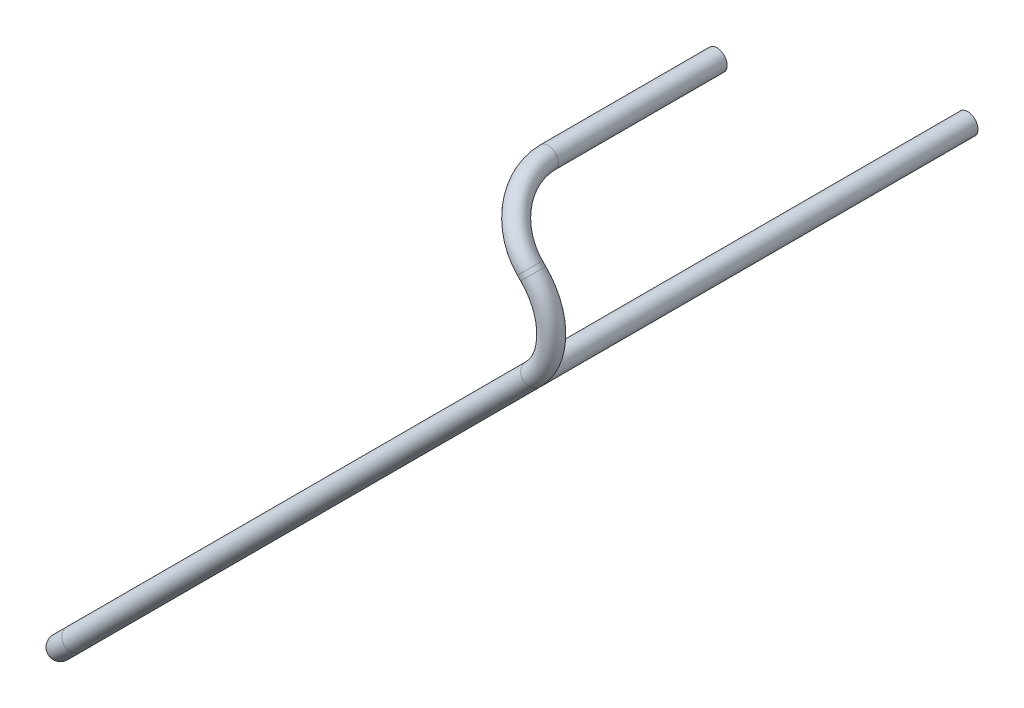
ISO-10303-21;
HEADER;
FILE_DESCRIPTION(('STEP AP214'),'2;1');
FILE_NAME('part.step','',(''),(''),'','','');
FILE_SCHEMA(('AUTOMOTIVE_DESIGN { 1 0 10303 214 1 1 1 1 }'));
ENDSEC;
DATA;
#1=APPLICATION_CONTEXT('core data for automotive mechanical design processes');
#2=APPLICATION_PROTOCOL_DEFINITION('international standard','automotive_design',2000,#1);
#3=PRODUCT_CONTEXT('',#1,'mechanical');
#4=PRODUCT('Part','Part','',(#3));
#5=PRODUCT_RELATED_PRODUCT_CATEGORY('part','',(#4));
#6=PRODUCT_DEFINITION_FORMATION('','',#4);
#7=PRODUCT_DEFINITION_CONTEXT('part definition',#1,'design');
#8=PRODUCT_DEFINITION('design','',#6,#7);
#9=PRODUCT_DEFINITION_SHAPE('','',#8);
#10=(LENGTH_UNIT() NAMED_UNIT(*) SI_UNIT(.MILLI.,.METRE.));
#11=(NAMED_UNIT(*) PLANE_ANGLE_UNIT() SI_UNIT($,.RADIAN.));
#12=(NAMED_UNIT(*) SI_UNIT($,.STERADIAN.) SOLID_ANGLE_UNIT());
#13=UNCERTAINTY_MEASURE_WITH_UNIT(LENGTH_MEASURE(1.E-05),#10,'distance_accuracy_value','');
#14=(GEOMETRIC_REPRESENTATION_CONTEXT(3) GLOBAL_UNCERTAINTY_ASSIGNED_CONTEXT((#13)) GLOBAL_UNIT_ASSIGNED_CONTEXT((#10,
#11,#12)) REPRESENTATION_CONTEXT('',''));
#15=CARTESIAN_POINT('',(0.,0.,0.));
#16=DIRECTION('',(0.,0.,1.));
#17=DIRECTION('',(1.,0.,0.));
#18=AXIS2_PLACEMENT_3D('',#15,#16,#17);
#19=CARTESIAN_POINT('',(282.010871305789,393.82561051938,541.779553996423));
#20=DIRECTION('',(0.,0.,-1.));
#21=DIRECTION('',(-1.,0.,0.));
#22=AXIS2_PLACEMENT_3D('',#19,#20,#21);
#23=CYLINDRICAL_SURFACE('',#22,6.35);
#24=CARTESIAN_POINT('',(282.010871305789,393.82561051938,541.779553996423));
#25=DIRECTION('',(0.,0.,-1.));
#26=DIRECTION('',(1.,0.,0.));
#27=AXIS2_PLACEMENT_3D('',#24,#25,#26);
#28=CIRCLE('',#27,6.35);
#29=CARTESIAN_POINT('',(277.520743245255,398.315738579914,541.779553996423));
#30=VERTEX_POINT('',#29);
#31=EDGE_CURVE('E37',#30,#30,#28,.T.);
#32=ORIENTED_EDGE('',*,*,#31,.T.);
#33=EDGE_LOOP('',(#32));
#34=FACE_BOUND('',#33,.T.);
#35=CARTESIAN_POINT('',(282.010871305789,393.82561051938,437.228053912724));
#36=DIRECTION('',(0.,0.,-1.));
#37=DIRECTION('',(1.,0.,0.));
#38=AXIS2_PLACEMENT_3D('',#35,#36,#37);
#39=CIRCLE('',#38,6.35);
#40=CARTESIAN_POINT('',(288.360871305789,393.82561051938,437.228053912724));
#41=VERTEX_POINT('',#40);
#42=EDGE_CURVE('E10',#41,#41,#39,.T.);
#43=ORIENTED_EDGE('',*,*,#42,.F.);
#44=EDGE_LOOP('',(#43));
#45=FACE_BOUND('',#44,.T.);
#46=ADVANCED_FACE('F31',(#34,#45),#23,.T.);
#47=CARTESIAN_POINT('',(308.951639668996,366.884842156173,541.779553996423));
#48=DIRECTION('',(-0.707106781186548,-0.707106781186548,0.));
#49=DIRECTION('',(0.707106781186548,-0.707106781186548,0.));
#50=AXIS2_PLACEMENT_3D('',#47,#48,#49);
#51=TOROIDAL_SURFACE('',#50,38.0999999999998,6.35);
#52=CARTESIAN_POINT('',(308.951639668996,366.884842156173,579.879553996423));
#53=DIRECTION('',(-0.707106781186547,0.707106781186548,0.));
#54=DIRECTION('',(0.499999999999997,0.500000000000003,-0.707106781186548));
#55=AXIS2_PLACEMENT_3D('',#52,#53,#54);
#56=CIRCLE('',#55,6.35);
#57=CARTESIAN_POINT('',(308.951639668996,366.884842156173,586.229553996423));
#58=VERTEX_POINT('',#57);
#59=EDGE_CURVE('E41',#58,#58,#56,.T.);
#60=CARTESIAN_POINT('',(308.951639668996,366.884842156173,541.779553996423));
#61=DIRECTION('',(-0.707106781186548,-0.707106781186548,0.));
#62=DIRECTION('',(0.707106781186548,-0.707106781186548,0.));
#63=AXIS2_PLACEMENT_3D('',#60,#61,#62);
#64=CIRCLE('',#63,44.4499999999998);
#65=EDGE_CURVE('',#58,#30,#64,.T.);
#66=ORIENTED_EDGE('',*,*,#59,.T.);
#67=ORIENTED_EDGE('',*,*,#31,.F.);
#68=ORIENTED_EDGE('',*,*,#65,.T.);
#69=ORIENTED_EDGE('',*,*,#65,.F.);
#70=EDGE_LOOP('',(#66,#68,#67,#69));
#71=FACE_BOUND('',#70,.T.);
#72=ADVANCED_FACE('F111',(#71),#51,.T.);
#73=CARTESIAN_POINT('',(310.977472549377,364.859009275792,579.879553996423));
#74=DIRECTION('',(-0.707106781186547,0.707106781186547,0.));
#75=DIRECTION('',(-0.707106781186548,-0.707106781186548,0.));
#76=AXIS2_PLACEMENT_3D('',#73,#74,#75);
#77=CYLINDRICAL_SURFACE('',#76,6.35);
#78=CARTESIAN_POINT('',(310.977472549377,364.859009275792,579.879553996423));
#79=DIRECTION('',(-0.707106781186547,0.707106781186548,0.));
#80=DIRECTION('',(0.499999999999997,0.500000000000003,-0.707106781186548));
#81=AXIS2_PLACEMENT_3D('',#78,#79,#80);
#82=CIRCLE('',#81,6.35);
#83=CARTESIAN_POINT('',(315.467600609912,369.349137336327,579.879553996423));
#84=VERTEX_POINT('',#83);
#85=EDGE_CURVE('E45',#84,#84,#82,.T.);
#86=ORIENTED_EDGE('',*,*,#85,.T.);
#87=EDGE_LOOP('',(#86));
#88=FACE_BOUND('',#87,.T.);
#89=ORIENTED_EDGE('',*,*,#59,.F.);
#90=EDGE_LOOP('',(#89));
#91=FACE_BOUND('',#90,.T.);
#92=ADVANCED_FACE('F115',(#88,#91),#77,.T.);
#93=CARTESIAN_POINT('',(284.03670418617,337.918240912585,579.879553996423));
#94=DIRECTION('',(0.,0.,1.));
#95=DIRECTION('',(1.,0.,0.));
#96=AXIS2_PLACEMENT_3D('',#93,#94,#95);
#97=TOROIDAL_SURFACE('',#96,38.1,6.35);
#98=CARTESIAN_POINT('',(310.977472549377,310.977472549377,579.879553996423));
#99=DIRECTION('',(0.707106781186548,0.707106781186547,0.));
#100=DIRECTION('',(0.500000000000003,-0.499999999999997,-0.707106781186548));
#101=AXIS2_PLACEMENT_3D('',#98,#99,#100);
#102=CIRCLE('',#101,6.35);
#103=CARTESIAN_POINT('',(315.467600609912,306.487344488842,579.879553996423));
#104=VERTEX_POINT('',#103);
#105=EDGE_CURVE('E50',#104,#104,#102,.T.);
#106=CARTESIAN_POINT('',(284.03670418617,337.918240912585,579.879553996423));
#107=DIRECTION('',(0.,0.,1.));
#108=DIRECTION('',(1.,0.,0.));
#109=AXIS2_PLACEMENT_3D('',#106,#107,#108);
#110=CIRCLE('',#109,44.45);
#111=EDGE_CURVE('',#104,#84,#110,.T.);
#112=ORIENTED_EDGE('',*,*,#105,.T.);
#113=ORIENTED_EDGE('',*,*,#85,.F.);
#114=ORIENTED_EDGE('',*,*,#111,.T.);
#115=ORIENTED_EDGE('',*,*,#111,.F.);
#116=EDGE_LOOP('',(#112,#114,#113,#115));
#117=FACE_BOUND('',#116,.T.);
#118=ADVANCED_FACE('F121',(#117),#97,.T.);
#119=CARTESIAN_POINT('',(26.9407683632075,26.9407683632075,579.879553996423));
#120=DIRECTION('',(0.707106781186547,0.707106781186547,0.));
#121=DIRECTION('',(-0.707106781186548,0.707106781186548,0.));
#122=AXIS2_PLACEMENT_3D('',#119,#120,#121);
#123=CYLINDRICAL_SURFACE('',#122,6.35);
#124=CARTESIAN_POINT('',(26.9407683632075,26.9407683632075,579.879553996423));
#125=DIRECTION('',(0.707106781186548,0.707106781186547,0.));
#126=DIRECTION('',(0.500000000000003,-0.499999999999997,-0.707106781186548));
#127=AXIS2_PLACEMENT_3D('',#124,#125,#126);
#128=CIRCLE('',#127,6.35);
#129=CARTESIAN_POINT('',(26.9407683632075,26.9407683632075,586.229553996423));
#130=VERTEX_POINT('',#129);
#131=EDGE_CURVE('E53',#130,#130,#128,.T.);
#132=ORIENTED_EDGE('',*,*,#131,.T.);
#133=EDGE_LOOP('',(#132));
#134=FACE_BOUND('',#133,.T.);
#135=ORIENTED_EDGE('',*,*,#105,.F.);
#136=EDGE_LOOP('',(#135));
#137=FACE_BOUND('',#136,.T.);
#138=ADVANCED_FACE('F128',(#134,#137),#123,.T.);
#139=CARTESIAN_POINT('',(26.9407683632075,26.9407683632075,541.779553996423));
#140=DIRECTION('',(-0.707106781186547,0.707106781186548,0.));
#141=DIRECTION('',(-0.707106781186548,-0.707106781186547,0.));
#142=AXIS2_PLACEMENT_3D('',#139,#140,#141);
#143=TOROIDAL_SURFACE('',#142,38.1,6.35);
#144=CARTESIAN_POINT('',(0.,0.,541.779553996423));
#145=DIRECTION('',(0.,0.,1.));
#146=DIRECTION('',(1.,0.,0.));
#147=AXIS2_PLACEMENT_3D('',#144,#145,#146);
#148=CIRCLE('',#147,6.35);
#149=CARTESIAN_POINT('',(-4.49012806053458,-4.49012806053457,541.779553996423));
#150=VERTEX_POINT('',#149);
#151=EDGE_CURVE('E56',#150,#150,#148,.T.);
#152=CARTESIAN_POINT('',(26.9407683632075,26.9407683632075,541.779553996423));
#153=DIRECTION('',(-0.707106781186547,0.707106781186548,0.));
#154=DIRECTION('',(-0.707106781186548,-0.707106781186547,0.));
#155=AXIS2_PLACEMENT_3D('',#152,#153,#154);
#156=CIRCLE('',#155,44.45);
#157=EDGE_CURVE('',#150,#130,#156,.T.);
#158=ORIENTED_EDGE('',*,*,#151,.T.);
#159=ORIENTED_EDGE('',*,*,#131,.F.);
#160=ORIENTED_EDGE('',*,*,#157,.T.);
#161=ORIENTED_EDGE('',*,*,#157,.F.);
#162=EDGE_LOOP('',(#158,#160,#159,#161));
#163=FACE_BOUND('',#162,.T.);
#164=ADVANCED_FACE('F106',(#163),#143,.T.);
#165=CARTESIAN_POINT('',(0.,0.,541.779553996423));
#166=DIRECTION('',(0.,0.,-1.));
#167=DIRECTION('',(-1.,0.,0.));
#168=AXIS2_PLACEMENT_3D('',#165,#166,#167);
#169=CYLINDRICAL_SURFACE('',#168,6.35);
#170=ORIENTED_EDGE('',*,*,#151,.F.);
#171=EDGE_LOOP('',(#170));
#172=FACE_BOUND('',#171,.T.);
#173=CARTESIAN_POINT('',(0.,0.,0.));
#174=DIRECTION('',(0.,0.,1.));
#175=DIRECTION('',(1.,0.,0.));
#176=AXIS2_PLACEMENT_3D('',#173,#174,#175);
#177=CIRCLE('',#176,6.35);
#178=CARTESIAN_POINT('',(6.35,0.,0.));
#179=VERTEX_POINT('',#178);
#180=EDGE_CURVE('E57',#179,#179,#177,.T.);
#181=ORIENTED_EDGE('',*,*,#180,.T.);
#182=EDGE_LOOP('',(#181));
#183=FACE_BOUND('',#182,.T.);
#184=ADVANCED_FACE('F98',(#172,#183),#169,.T.);
#185=CARTESIAN_POINT('',(282.010871305789,393.82561051938,437.228053912724));
#186=DIRECTION('',(0.,0.,-1.));
#187=DIRECTION('',(1.,0.,0.));
#188=AXIS2_PLACEMENT_3D('',#185,#186,#187);
#189=PLANE('',#188);
#190=CARTESIAN_POINT('',(282.010871305789,393.82561051938,437.228053912724));
#191=DIRECTION('',(0.,0.,-1.));
#192=DIRECTION('',(-1.,0.,0.));
#193=AXIS2_PLACEMENT_3D('',#190,#191,#192);
#194=CIRCLE('',#193,5.1054);
#195=CARTESIAN_POINT('',(276.905471305789,393.82561051938,437.228053912724));
#196=VERTEX_POINT('',#195);
#197=EDGE_CURVE('E60',#196,#196,#194,.T.);
#198=ORIENTED_EDGE('',*,*,#197,.F.);
#199=EDGE_LOOP('',(#198));
#200=FACE_BOUND('',#199,.T.);
#201=ORIENTED_EDGE('',*,*,#42,.T.);
#202=EDGE_LOOP('',(#201));
#203=FACE_BOUND('',#202,.T.);
#204=ADVANCED_FACE('F96',(#200,#203),#189,.T.);
#205=CARTESIAN_POINT('',(0.,0.,0.));
#206=DIRECTION('',(0.,0.,1.));
#207=DIRECTION('',(1.,0.,0.));
#208=AXIS2_PLACEMENT_3D('',#205,#206,#207);
#209=PLANE('',#208);
#210=CARTESIAN_POINT('',(0.,0.,0.));
#211=DIRECTION('',(0.,0.,1.));
#212=DIRECTION('',(1.,0.,0.));
#213=AXIS2_PLACEMENT_3D('',#210,#211,#212);
#214=CIRCLE('',#213,5.1054);
#215=CARTESIAN_POINT('',(5.1054,0.,0.));
#216=VERTEX_POINT('',#215);
#217=EDGE_CURVE('E63',#216,#216,#214,.T.);
#218=ORIENTED_EDGE('',*,*,#217,.T.);
#219=EDGE_LOOP('',(#218));
#220=FACE_BOUND('',#219,.T.);
#221=ORIENTED_EDGE('',*,*,#180,.F.);
#222=EDGE_LOOP('',(#221));
#223=FACE_BOUND('',#222,.T.);
#224=ADVANCED_FACE('F92',(#220,#223),#209,.F.);
#225=CARTESIAN_POINT('',(282.010871305789,393.82561051938,541.779553996423));
#226=DIRECTION('',(0.,0.,-1.));
#227=DIRECTION('',(-1.,0.,0.));
#228=AXIS2_PLACEMENT_3D('',#225,#226,#227);
#229=CYLINDRICAL_SURFACE('',#228,5.1054);
#230=CARTESIAN_POINT('',(282.010871305789,393.82561051938,541.779553996423));
#231=DIRECTION('',(0.,0.,-1.));
#232=DIRECTION('',(-1.,0.,0.));
#233=AXIS2_PLACEMENT_3D('',#230,#231,#232);
#234=CIRCLE('',#233,5.1054);
#235=CARTESIAN_POINT('',(278.400808345119,397.43567348005,541.779553996423));
#236=VERTEX_POINT('',#235);
#237=EDGE_CURVE('E69',#236,#236,#234,.T.);
#238=ORIENTED_EDGE('',*,*,#237,.F.);
#239=EDGE_LOOP('',(#238));
#240=FACE_BOUND('',#239,.T.);
#241=ORIENTED_EDGE('',*,*,#197,.T.);
#242=EDGE_LOOP('',(#241));
#243=FACE_BOUND('',#242,.T.);
#244=ADVANCED_FACE('F89',(#240,#243),#229,.F.);
#245=CARTESIAN_POINT('',(308.951639668996,366.884842156173,541.779553996423));
#246=DIRECTION('',(-0.707106781186548,-0.707106781186548,0.));
#247=DIRECTION('',(0.707106781186548,-0.707106781186548,0.));
#248=AXIS2_PLACEMENT_3D('',#245,#246,#247);
#249=TOROIDAL_SURFACE('',#248,38.0999999999998,5.1054);
#250=CARTESIAN_POINT('',(308.951639668996,366.884842156172,579.879553996423));
#251=DIRECTION('',(0.707106781186548,-0.707106781186548,0.));
#252=DIRECTION('',(0.707106781186548,0.707106781186548,0.));
#253=AXIS2_PLACEMENT_3D('',#250,#251,#252);
#254=CIRCLE('',#253,5.1054);
#255=CARTESIAN_POINT('',(308.951639668996,366.884842156172,584.984953996423));
#256=VERTEX_POINT('',#255);
#257=EDGE_CURVE('E81',#256,#256,#254,.F.);
#258=CARTESIAN_POINT('',(308.951639668996,366.884842156173,541.779553996423));
#259=DIRECTION('',(-0.707106781186548,-0.707106781186548,0.));
#260=DIRECTION('',(0.707106781186548,-0.707106781186548,0.));
#261=AXIS2_PLACEMENT_3D('',#258,#259,#260);
#262=CIRCLE('',#261,43.2053999999998);
#263=EDGE_CURVE('',#256,#236,#262,.T.);
#264=ORIENTED_EDGE('',*,*,#257,.F.);
#265=ORIENTED_EDGE('',*,*,#237,.T.);
#266=ORIENTED_EDGE('',*,*,#263,.T.);
#267=ORIENTED_EDGE('',*,*,#263,.F.);
#268=EDGE_LOOP('',(#264,#266,#265,#267));
#269=FACE_BOUND('',#268,.T.);
#270=ADVANCED_FACE('F87',(#269),#249,.F.);
#271=CARTESIAN_POINT('',(310.977472549377,364.859009275792,579.879553996423));
#272=DIRECTION('',(-0.707106781186547,0.707106781186547,0.));
#273=DIRECTION('',(-0.707106781186548,-0.707106781186548,0.));
#274=AXIS2_PLACEMENT_3D('',#271,#272,#273);
#275=CYLINDRICAL_SURFACE('',#274,5.1054);
#276=CARTESIAN_POINT('',(310.977472549377,364.859009275792,579.879553996423));
#277=DIRECTION('',(-0.707106781186547,0.707106781186547,0.));
#278=DIRECTION('',(-0.707106781186548,-0.707106781186548,0.));
#279=AXIS2_PLACEMENT_3D('',#276,#277,#278);
#280=CIRCLE('',#279,5.1054);
#281=CARTESIAN_POINT('',(314.587535510047,368.469072236462,579.879553996423));
#282=VERTEX_POINT('',#281);
#283=EDGE_CURVE('E78',#282,#282,#280,.T.);
#284=ORIENTED_EDGE('',*,*,#283,.F.);
#285=EDGE_LOOP('',(#284));
#286=FACE_BOUND('',#285,.T.);
#287=ORIENTED_EDGE('',*,*,#257,.T.);
#288=EDGE_LOOP('',(#287));
#289=FACE_BOUND('',#288,.T.);
#290=ADVANCED_FACE('F180',(#286,#289),#275,.F.);
#291=CARTESIAN_POINT('',(284.03670418617,337.918240912585,579.879553996423));
#292=DIRECTION('',(0.,0.,1.));
#293=DIRECTION('',(1.,0.,0.));
#294=AXIS2_PLACEMENT_3D('',#291,#292,#293);
#295=TOROIDAL_SURFACE('',#294,38.1,5.1054);
#296=CARTESIAN_POINT('',(310.977472549377,310.977472549377,579.879553996423));
#297=DIRECTION('',(-0.707106781186548,-0.707106781186547,0.));
#298=DIRECTION('',(0.707106781186547,-0.707106781186548,0.));
#299=AXIS2_PLACEMENT_3D('',#296,#297,#298);
#300=CIRCLE('',#299,5.1054);
#301=CARTESIAN_POINT('',(314.587535510047,307.367409588707,579.879553996423));
#302=VERTEX_POINT('',#301);
#303=EDGE_CURVE('E75',#302,#302,#300,.F.);
#304=CARTESIAN_POINT('',(284.03670418617,337.918240912585,579.879553996423));
#305=DIRECTION('',(0.,0.,1.));
#306=DIRECTION('',(1.,0.,0.));
#307=AXIS2_PLACEMENT_3D('',#304,#305,#306);
#308=CIRCLE('',#307,43.2054);
#309=EDGE_CURVE('',#302,#282,#308,.T.);
#310=ORIENTED_EDGE('',*,*,#303,.F.);
#311=ORIENTED_EDGE('',*,*,#283,.T.);
#312=ORIENTED_EDGE('',*,*,#309,.T.);
#313=ORIENTED_EDGE('',*,*,#309,.F.);
#314=EDGE_LOOP('',(#310,#312,#311,#313));
#315=FACE_BOUND('',#314,.T.);
#316=ADVANCED_FACE('F190',(#315),#295,.F.);
#317=CARTESIAN_POINT('',(26.9407683632075,26.9407683632075,579.879553996423));
#318=DIRECTION('',(0.707106781186547,0.707106781186547,0.));
#319=DIRECTION('',(-0.707106781186548,0.707106781186548,0.));
#320=AXIS2_PLACEMENT_3D('',#317,#318,#319);
#321=CYLINDRICAL_SURFACE('',#320,5.1054);
#322=CARTESIAN_POINT('',(26.9407683632075,26.9407683632075,579.879553996423));
#323=DIRECTION('',(0.707106781186547,0.707106781186547,0.));
#324=DIRECTION('',(-0.707106781186548,0.707106781186548,0.));
#325=AXIS2_PLACEMENT_3D('',#322,#323,#324);
#326=CIRCLE('',#325,5.1054);
#327=CARTESIAN_POINT('',(26.9407683632075,26.9407683632075,584.984953996423));
#328=VERTEX_POINT('',#327);
#329=EDGE_CURVE('E72',#328,#328,#326,.T.);
#330=ORIENTED_EDGE('',*,*,#329,.F.);
#331=EDGE_LOOP('',(#330));
#332=FACE_BOUND('',#331,.T.);
#333=ORIENTED_EDGE('',*,*,#303,.T.);
#334=EDGE_LOOP('',(#333));
#335=FACE_BOUND('',#334,.T.);
#336=ADVANCED_FACE('F200',(#332,#335),#321,.F.);
#337=CARTESIAN_POINT('',(26.9407683632075,26.9407683632075,541.779553996423));
#338=DIRECTION('',(-0.707106781186547,0.707106781186548,0.));
#339=DIRECTION('',(-0.707106781186548,-0.707106781186547,0.));
#340=AXIS2_PLACEMENT_3D('',#337,#338,#339);
#341=TOROIDAL_SURFACE('',#340,38.1,5.1054);
#342=CARTESIAN_POINT('',(0.,0.,541.779553996423));
#343=DIRECTION('',(0.,0.,-1.));
#344=DIRECTION('',(-1.,0.,0.));
#345=AXIS2_PLACEMENT_3D('',#342,#343,#344);
#346=CIRCLE('',#345,5.1054);
#347=CARTESIAN_POINT('',(-3.61006296066979,-3.61006296066979,541.779553996423));
#348=VERTEX_POINT('',#347);
#349=EDGE_CURVE('E66',#348,#348,#346,.F.);
#350=CARTESIAN_POINT('',(26.9407683632075,26.9407683632075,541.779553996423));
#351=DIRECTION('',(-0.707106781186547,0.707106781186548,0.));
#352=DIRECTION('',(-0.707106781186548,-0.707106781186547,0.));
#353=AXIS2_PLACEMENT_3D('',#350,#351,#352);
#354=CIRCLE('',#353,43.2054);
#355=EDGE_CURVE('',#348,#328,#354,.T.);
#356=ORIENTED_EDGE('',*,*,#349,.F.);
#357=ORIENTED_EDGE('',*,*,#329,.T.);
#358=ORIENTED_EDGE('',*,*,#355,.T.);
#359=ORIENTED_EDGE('',*,*,#355,.F.);
#360=EDGE_LOOP('',(#356,#358,#357,#359));
#361=FACE_BOUND('',#360,.T.);
#362=ADVANCED_FACE('F210',(#361),#341,.F.);
#363=CARTESIAN_POINT('',(0.,0.,541.779553996423));
#364=DIRECTION('',(0.,0.,-1.));
#365=DIRECTION('',(-1.,0.,0.));
#366=AXIS2_PLACEMENT_3D('',#363,#364,#365);
#367=CYLINDRICAL_SURFACE('',#366,5.1054);
#368=ORIENTED_EDGE('',*,*,#349,.T.);
#369=EDGE_LOOP('',(#368));
#370=FACE_BOUND('',#369,.T.);
#371=ORIENTED_EDGE('',*,*,#217,.F.);
#372=EDGE_LOOP('',(#371));
#373=FACE_BOUND('',#372,.T.);
#374=ADVANCED_FACE('F220',(#370,#373),#367,.F.);
#375=CLOSED_SHELL('',(#46,#72,#92,#118,#138,#164,#184,#204,#224,#244,#270,#290,#316,#336,#362,#374));
#376=MANIFOLD_SOLID_BREP('B2',#375);
#377=ADVANCED_BREP_SHAPE_REPRESENTATION('',(#18,#376),#14);
#378=SHAPE_DEFINITION_REPRESENTATION(#9,#377);
ENDSEC;
END-ISO-10303-21;
